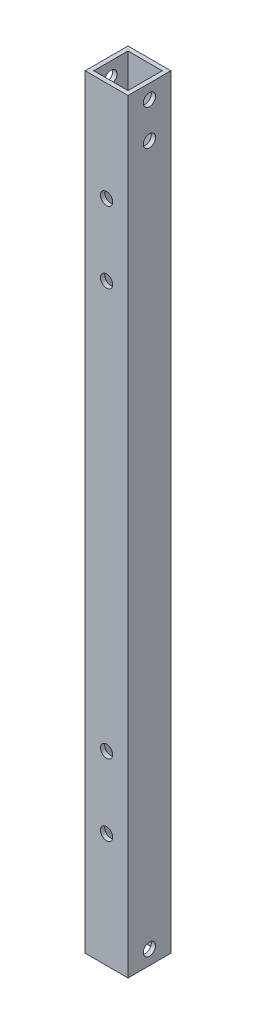
ISO-10303-21;
HEADER;
FILE_DESCRIPTION(('STEP AP214'),'2;1');
FILE_NAME('part.step','',(''),(''),'','','');
FILE_SCHEMA(('AUTOMOTIVE_DESIGN { 1 0 10303 214 1 1 1 1 }'));
ENDSEC;
DATA;
#1=APPLICATION_CONTEXT('core data for automotive mechanical design processes');
#2=APPLICATION_PROTOCOL_DEFINITION('international standard','automotive_design',2000,#1);
#3=PRODUCT_CONTEXT('',#1,'mechanical');
#4=PRODUCT('Part','Part','',(#3));
#5=PRODUCT_RELATED_PRODUCT_CATEGORY('part','',(#4));
#6=PRODUCT_DEFINITION_FORMATION('','',#4);
#7=PRODUCT_DEFINITION_CONTEXT('part definition',#1,'design');
#8=PRODUCT_DEFINITION('design','',#6,#7);
#9=PRODUCT_DEFINITION_SHAPE('','',#8);
#10=(LENGTH_UNIT() NAMED_UNIT(*) SI_UNIT(.MILLI.,.METRE.));
#11=(NAMED_UNIT(*) PLANE_ANGLE_UNIT() SI_UNIT($,.RADIAN.));
#12=(NAMED_UNIT(*) SI_UNIT($,.STERADIAN.) SOLID_ANGLE_UNIT());
#13=UNCERTAINTY_MEASURE_WITH_UNIT(LENGTH_MEASURE(1.E-05),#10,'distance_accuracy_value','');
#14=(GEOMETRIC_REPRESENTATION_CONTEXT(3) GLOBAL_UNCERTAINTY_ASSIGNED_CONTEXT((#13)) GLOBAL_UNIT_ASSIGNED_CONTEXT((#10,
#11,#12)) REPRESENTATION_CONTEXT('',''));
#15=CARTESIAN_POINT('',(0.,0.,0.));
#16=DIRECTION('',(0.,0.,1.));
#17=DIRECTION('',(1.,0.,0.));
#18=AXIS2_PLACEMENT_3D('',#15,#16,#17);
#19=CARTESIAN_POINT('',(0.,267.5,0.));
#20=DIRECTION('',(0.,1.,0.));
#21=DIRECTION('',(0.,0.,1.));
#22=AXIS2_PLACEMENT_3D('',#19,#20,#21);
#23=PLANE('',#22);
#24=DIRECTION('',(0.,0.,-1.));
#25=VECTOR('',#24,1.);
#26=CARTESIAN_POINT('',(7.5,267.5,-7.5));
#27=LINE('',#26,#25);
#28=CARTESIAN_POINT('',(7.5,267.5,7.5));
#29=VERTEX_POINT('',#28);
#30=CARTESIAN_POINT('',(7.5,267.5,-7.5));
#31=VERTEX_POINT('',#30);
#32=EDGE_CURVE('E164',#29,#31,#27,.T.);
#33=ORIENTED_EDGE('',*,*,#32,.T.);
#34=DIRECTION('',(-1.,0.,0.));
#35=VECTOR('',#34,1.);
#36=CARTESIAN_POINT('',(-7.5,267.5,-7.5));
#37=LINE('',#36,#35);
#38=CARTESIAN_POINT('',(-7.5,267.5,-7.5));
#39=VERTEX_POINT('',#38);
#40=EDGE_CURVE('E167',#31,#39,#37,.T.);
#41=ORIENTED_EDGE('',*,*,#40,.T.);
#42=DIRECTION('',(0.,0.,1.));
#43=VECTOR('',#42,1.);
#44=CARTESIAN_POINT('',(-7.5,267.5,-7.5));
#45=LINE('',#44,#43);
#46=CARTESIAN_POINT('',(-7.5,267.5,7.5));
#47=VERTEX_POINT('',#46);
#48=EDGE_CURVE('E170',#39,#47,#45,.T.);
#49=ORIENTED_EDGE('',*,*,#48,.T.);
#50=DIRECTION('',(1.,0.,0.));
#51=VECTOR('',#50,1.);
#52=CARTESIAN_POINT('',(-7.5,267.5,7.5));
#53=LINE('',#52,#51);
#54=EDGE_CURVE('E172',#47,#29,#53,.T.);
#55=ORIENTED_EDGE('',*,*,#54,.T.);
#56=EDGE_LOOP('',(#33,#41,#49,#55));
#57=FACE_BOUND('',#56,.T.);
#58=DIRECTION('',(-1.,0.,0.));
#59=VECTOR('',#58,1.);
#60=CARTESIAN_POINT('',(-7.5,267.5,-6.));
#61=LINE('',#60,#59);
#62=CARTESIAN_POINT('',(6.,267.5,-6.));
#63=VERTEX_POINT('',#62);
#64=CARTESIAN_POINT('',(-6.,267.5,-6.));
#65=VERTEX_POINT('',#64);
#66=EDGE_CURVE('E134',#63,#65,#61,.T.);
#67=ORIENTED_EDGE('',*,*,#66,.F.);
#68=DIRECTION('',(0.,0.,-1.));
#69=VECTOR('',#68,1.);
#70=CARTESIAN_POINT('',(6.,267.5,-7.5));
#71=LINE('',#70,#69);
#72=CARTESIAN_POINT('',(6.,267.5,6.));
#73=VERTEX_POINT('',#72);
#74=EDGE_CURVE('E126',#73,#63,#71,.T.);
#75=ORIENTED_EDGE('',*,*,#74,.F.);
#76=DIRECTION('',(1.,0.,0.));
#77=VECTOR('',#76,1.);
#78=CARTESIAN_POINT('',(-7.5,267.5,6.));
#79=LINE('',#78,#77);
#80=CARTESIAN_POINT('',(-6.,267.5,6.));
#81=VERTEX_POINT('',#80);
#82=EDGE_CURVE('E148',#81,#73,#79,.T.);
#83=ORIENTED_EDGE('',*,*,#82,.F.);
#84=DIRECTION('',(0.,0.,1.));
#85=VECTOR('',#84,1.);
#86=CARTESIAN_POINT('',(-6.,267.5,-7.5));
#87=LINE('',#86,#85);
#88=EDGE_CURVE('E146',#65,#81,#87,.T.);
#89=ORIENTED_EDGE('',*,*,#88,.F.);
#90=EDGE_LOOP('',(#67,#75,#83,#89));
#91=FACE_BOUND('',#90,.T.);
#92=ADVANCED_FACE('F59',(#57,#91),#23,.T.);
#93=CARTESIAN_POINT('',(0.,0.,0.));
#94=DIRECTION('',(0.,1.,0.));
#95=DIRECTION('',(0.,0.,1.));
#96=AXIS2_PLACEMENT_3D('',#93,#94,#95);
#97=PLANE('',#96);
#98=DIRECTION('',(0.,0.,-1.));
#99=VECTOR('',#98,1.);
#100=CARTESIAN_POINT('',(7.5,0.,-7.5));
#101=LINE('',#100,#99);
#102=CARTESIAN_POINT('',(7.5,0.,7.5));
#103=VERTEX_POINT('',#102);
#104=CARTESIAN_POINT('',(7.5,0.,-7.5));
#105=VERTEX_POINT('',#104);
#106=EDGE_CURVE('E142',#103,#105,#101,.T.);
#107=ORIENTED_EDGE('',*,*,#106,.F.);
#108=DIRECTION('',(1.,0.,0.));
#109=VECTOR('',#108,1.);
#110=CARTESIAN_POINT('',(-7.5,0.,7.5));
#111=LINE('',#110,#109);
#112=CARTESIAN_POINT('',(-7.5,0.,7.5));
#113=VERTEX_POINT('',#112);
#114=EDGE_CURVE('E168',#113,#103,#111,.T.);
#115=ORIENTED_EDGE('',*,*,#114,.F.);
#116=DIRECTION('',(0.,0.,1.));
#117=VECTOR('',#116,1.);
#118=CARTESIAN_POINT('',(-7.5,0.,-7.5));
#119=LINE('',#118,#117);
#120=CARTESIAN_POINT('',(-7.5,0.,-7.5));
#121=VERTEX_POINT('',#120);
#122=EDGE_CURVE('E179',#121,#113,#119,.T.);
#123=ORIENTED_EDGE('',*,*,#122,.F.);
#124=DIRECTION('',(-1.,0.,0.));
#125=VECTOR('',#124,1.);
#126=CARTESIAN_POINT('',(-7.5,0.,-7.5));
#127=LINE('',#126,#125);
#128=EDGE_CURVE('E177',#105,#121,#127,.T.);
#129=ORIENTED_EDGE('',*,*,#128,.F.);
#130=EDGE_LOOP('',(#107,#115,#123,#129));
#131=FACE_BOUND('',#130,.T.);
#132=DIRECTION('',(0.,0.,-1.));
#133=VECTOR('',#132,1.);
#134=CARTESIAN_POINT('',(6.,0.,-7.5));
#135=LINE('',#134,#133);
#136=CARTESIAN_POINT('',(6.,0.,6.));
#137=VERTEX_POINT('',#136);
#138=CARTESIAN_POINT('',(6.,0.,-6.));
#139=VERTEX_POINT('',#138);
#140=EDGE_CURVE('E84',#137,#139,#135,.T.);
#141=ORIENTED_EDGE('',*,*,#140,.T.);
#142=DIRECTION('',(-1.,0.,0.));
#143=VECTOR('',#142,1.);
#144=CARTESIAN_POINT('',(-7.5,0.,-6.));
#145=LINE('',#144,#143);
#146=CARTESIAN_POINT('',(-6.,0.,-6.));
#147=VERTEX_POINT('',#146);
#148=EDGE_CURVE('E141',#139,#147,#145,.T.);
#149=ORIENTED_EDGE('',*,*,#148,.T.);
#150=DIRECTION('',(0.,0.,1.));
#151=VECTOR('',#150,1.);
#152=CARTESIAN_POINT('',(-6.,0.,-7.5));
#153=LINE('',#152,#151);
#154=CARTESIAN_POINT('',(-6.,0.,6.));
#155=VERTEX_POINT('',#154);
#156=EDGE_CURVE('E156',#147,#155,#153,.T.);
#157=ORIENTED_EDGE('',*,*,#156,.T.);
#158=DIRECTION('',(1.,0.,0.));
#159=VECTOR('',#158,1.);
#160=CARTESIAN_POINT('',(-7.5,0.,6.));
#161=LINE('',#160,#159);
#162=EDGE_CURVE('E135',#155,#137,#161,.T.);
#163=ORIENTED_EDGE('',*,*,#162,.T.);
#164=EDGE_LOOP('',(#141,#149,#157,#163));
#165=FACE_BOUND('',#164,.T.);
#166=ADVANCED_FACE('F263',(#131,#165),#97,.F.);
#167=CARTESIAN_POINT('',(7.5,267.5,-7.5));
#168=DIRECTION('',(-1.,0.,0.));
#169=DIRECTION('',(0.,0.,1.));
#170=AXIS2_PLACEMENT_3D('',#167,#168,#169);
#171=PLANE('',#170);
#172=CARTESIAN_POINT('',(7.5,5.,0.));
#173=DIRECTION('',(-1.,0.,0.));
#174=DIRECTION('',(0.,0.,1.));
#175=AXIS2_PLACEMENT_3D('',#172,#173,#174);
#176=CIRCLE('',#175,2.15);
#177=CARTESIAN_POINT('',(7.5,5.,2.15000000000004));
#178=VERTEX_POINT('',#177);
#179=EDGE_CURVE('E229',#178,#178,#176,.T.);
#180=ORIENTED_EDGE('',*,*,#179,.T.);
#181=EDGE_LOOP('',(#180));
#182=FACE_BOUND('',#181,.T.);
#183=CARTESIAN_POINT('',(7.5,262.5,0.));
#184=DIRECTION('',(-1.,0.,0.));
#185=DIRECTION('',(0.,0.,1.));
#186=AXIS2_PLACEMENT_3D('',#183,#184,#185);
#187=CIRCLE('',#186,2.15000000000001);
#188=CARTESIAN_POINT('',(7.5,262.5,2.15000000000005));
#189=VERTEX_POINT('',#188);
#190=EDGE_CURVE('E235',#189,#189,#187,.T.);
#191=ORIENTED_EDGE('',*,*,#190,.T.);
#192=EDGE_LOOP('',(#191));
#193=FACE_BOUND('',#192,.T.);
#194=CARTESIAN_POINT('',(7.5,250.,0.));
#195=DIRECTION('',(-1.,0.,0.));
#196=DIRECTION('',(0.,0.,1.));
#197=AXIS2_PLACEMENT_3D('',#194,#195,#196);
#198=CIRCLE('',#197,2.15000000000001);
#199=CARTESIAN_POINT('',(7.5,250.,2.15000000000005));
#200=VERTEX_POINT('',#199);
#201=EDGE_CURVE('E226',#200,#200,#198,.T.);
#202=ORIENTED_EDGE('',*,*,#201,.T.);
#203=EDGE_LOOP('',(#202));
#204=FACE_BOUND('',#203,.T.);
#205=ORIENTED_EDGE('',*,*,#106,.T.);
#206=DIRECTION('',(0.,-1.,0.));
#207=VECTOR('',#206,1.);
#208=CARTESIAN_POINT('',(7.5,267.5,-7.5));
#209=LINE('',#208,#207);
#210=EDGE_CURVE('E12',#31,#105,#209,.T.);
#211=ORIENTED_EDGE('',*,*,#210,.F.);
#212=ORIENTED_EDGE('',*,*,#32,.F.);
#213=DIRECTION('',(0.,-1.,0.));
#214=VECTOR('',#213,1.);
#215=CARTESIAN_POINT('',(7.5,267.5,7.5));
#216=LINE('',#215,#214);
#217=EDGE_CURVE('E174',#29,#103,#216,.T.);
#218=ORIENTED_EDGE('',*,*,#217,.T.);
#219=EDGE_LOOP('',(#205,#211,#212,#218));
#220=FACE_BOUND('',#219,.T.);
#221=ADVANCED_FACE('F61',(#182,#193,#204,#220),#171,.F.);
#222=CARTESIAN_POINT('',(-7.5,267.5,-7.5));
#223=DIRECTION('',(0.,0.,1.));
#224=DIRECTION('',(1.,0.,0.));
#225=AXIS2_PLACEMENT_3D('',#222,#223,#224);
#226=PLANE('',#225);
#227=CARTESIAN_POINT('',(0.,40.,-7.5));
#228=DIRECTION('',(0.,0.,1.));
#229=DIRECTION('',(1.,0.,0.));
#230=AXIS2_PLACEMENT_3D('',#227,#228,#229);
#231=CIRCLE('',#230,2.15);
#232=CARTESIAN_POINT('',(2.15,40.,-7.5));
#233=VERTEX_POINT('',#232);
#234=EDGE_CURVE('E374',#233,#233,#231,.T.);
#235=ORIENTED_EDGE('',*,*,#234,.T.);
#236=EDGE_LOOP('',(#235));
#237=FACE_BOUND('',#236,.T.);
#238=CARTESIAN_POINT('',(0.,65.,-7.5));
#239=DIRECTION('',(0.,0.,1.));
#240=DIRECTION('',(1.,0.,0.));
#241=AXIS2_PLACEMENT_3D('',#238,#239,#240);
#242=CIRCLE('',#241,2.15);
#243=CARTESIAN_POINT('',(2.15,65.,-7.5));
#244=VERTEX_POINT('',#243);
#245=EDGE_CURVE('E366',#244,#244,#242,.T.);
#246=ORIENTED_EDGE('',*,*,#245,.T.);
#247=EDGE_LOOP('',(#246));
#248=FACE_BOUND('',#247,.T.);
#249=CARTESIAN_POINT('',(0.,232.5,-7.5));
#250=DIRECTION('',(0.,0.,1.));
#251=DIRECTION('',(1.,0.,0.));
#252=AXIS2_PLACEMENT_3D('',#249,#250,#251);
#253=CIRCLE('',#252,2.15000000000002);
#254=CARTESIAN_POINT('',(2.15000000000002,232.5,-7.5));
#255=VERTEX_POINT('',#254);
#256=EDGE_CURVE('E359',#255,#255,#253,.T.);
#257=ORIENTED_EDGE('',*,*,#256,.T.);
#258=EDGE_LOOP('',(#257));
#259=FACE_BOUND('',#258,.T.);
#260=CARTESIAN_POINT('',(0.,207.5,-7.5));
#261=DIRECTION('',(0.,0.,1.));
#262=DIRECTION('',(1.,0.,0.));
#263=AXIS2_PLACEMENT_3D('',#260,#261,#262);
#264=CIRCLE('',#263,2.15000000000001);
#265=CARTESIAN_POINT('',(2.15000000000002,207.5,-7.5));
#266=VERTEX_POINT('',#265);
#267=EDGE_CURVE('E205',#266,#266,#264,.T.);
#268=ORIENTED_EDGE('',*,*,#267,.T.);
#269=EDGE_LOOP('',(#268));
#270=FACE_BOUND('',#269,.T.);
#271=ORIENTED_EDGE('',*,*,#128,.T.);
#272=DIRECTION('',(0.,-1.,0.));
#273=VECTOR('',#272,1.);
#274=CARTESIAN_POINT('',(-7.5,267.5,-7.5));
#275=LINE('',#274,#273);
#276=EDGE_CURVE('E68',#39,#121,#275,.T.);
#277=ORIENTED_EDGE('',*,*,#276,.F.);
#278=ORIENTED_EDGE('',*,*,#40,.F.);
#279=ORIENTED_EDGE('',*,*,#210,.T.);
#280=EDGE_LOOP('',(#271,#277,#278,#279));
#281=FACE_BOUND('',#280,.T.);
#282=ADVANCED_FACE('F262',(#237,#248,#259,#270,#281),#226,.F.);
#283=CARTESIAN_POINT('',(-7.5,267.5,-7.5));
#284=DIRECTION('',(1.,0.,0.));
#285=DIRECTION('',(0.,0.,-1.));
#286=AXIS2_PLACEMENT_3D('',#283,#284,#285);
#287=PLANE('',#286);
#288=CARTESIAN_POINT('',(-7.5,5.,0.));
#289=DIRECTION('',(-1.,0.,0.));
#290=DIRECTION('',(0.,0.,1.));
#291=AXIS2_PLACEMENT_3D('',#288,#289,#290);
#292=CIRCLE('',#291,2.15);
#293=CARTESIAN_POINT('',(-7.5,5.,2.15000000000004));
#294=VERTEX_POINT('',#293);
#295=EDGE_CURVE('E193',#294,#294,#292,.T.);
#296=ORIENTED_EDGE('',*,*,#295,.F.);
#297=EDGE_LOOP('',(#296));
#298=FACE_BOUND('',#297,.T.);
#299=CARTESIAN_POINT('',(-7.5,262.5,0.));
#300=DIRECTION('',(-1.,0.,0.));
#301=DIRECTION('',(0.,0.,1.));
#302=AXIS2_PLACEMENT_3D('',#299,#300,#301);
#303=CIRCLE('',#302,2.15000000000001);
#304=CARTESIAN_POINT('',(-7.5,262.5,2.15000000000005));
#305=VERTEX_POINT('',#304);
#306=EDGE_CURVE('E232',#305,#305,#303,.T.);
#307=ORIENTED_EDGE('',*,*,#306,.F.);
#308=EDGE_LOOP('',(#307));
#309=FACE_BOUND('',#308,.T.);
#310=CARTESIAN_POINT('',(-7.5,250.,0.));
#311=DIRECTION('',(-1.,0.,0.));
#312=DIRECTION('',(0.,0.,1.));
#313=AXIS2_PLACEMENT_3D('',#310,#311,#312);
#314=CIRCLE('',#313,2.15000000000001);
#315=CARTESIAN_POINT('',(-7.5,250.,2.15000000000005));
#316=VERTEX_POINT('',#315);
#317=EDGE_CURVE('E238',#316,#316,#314,.T.);
#318=ORIENTED_EDGE('',*,*,#317,.F.);
#319=EDGE_LOOP('',(#318));
#320=FACE_BOUND('',#319,.T.);
#321=ORIENTED_EDGE('',*,*,#122,.T.);
#322=DIRECTION('',(0.,-1.,0.));
#323=VECTOR('',#322,1.);
#324=CARTESIAN_POINT('',(-7.5,267.5,7.5));
#325=LINE('',#324,#323);
#326=EDGE_CURVE('E184',#47,#113,#325,.T.);
#327=ORIENTED_EDGE('',*,*,#326,.F.);
#328=ORIENTED_EDGE('',*,*,#48,.F.);
#329=ORIENTED_EDGE('',*,*,#276,.T.);
#330=EDGE_LOOP('',(#321,#327,#328,#329));
#331=FACE_BOUND('',#330,.T.);
#332=ADVANCED_FACE('F285',(#298,#309,#320,#331),#287,.F.);
#333=CARTESIAN_POINT('',(-7.5,267.5,7.5));
#334=DIRECTION('',(0.,0.,-1.));
#335=DIRECTION('',(-1.,0.,0.));
#336=AXIS2_PLACEMENT_3D('',#333,#334,#335);
#337=PLANE('',#336);
#338=CARTESIAN_POINT('',(0.,40.,7.5));
#339=DIRECTION('',(0.,0.,1.));
#340=DIRECTION('',(1.,0.,0.));
#341=AXIS2_PLACEMENT_3D('',#338,#339,#340);
#342=CIRCLE('',#341,2.15);
#343=CARTESIAN_POINT('',(2.15,40.,7.5));
#344=VERTEX_POINT('',#343);
#345=EDGE_CURVE('E377',#344,#344,#342,.T.);
#346=ORIENTED_EDGE('',*,*,#345,.F.);
#347=EDGE_LOOP('',(#346));
#348=FACE_BOUND('',#347,.T.);
#349=CARTESIAN_POINT('',(0.,65.,7.5));
#350=DIRECTION('',(0.,0.,1.));
#351=DIRECTION('',(1.,0.,0.));
#352=AXIS2_PLACEMENT_3D('',#349,#350,#351);
#353=CIRCLE('',#352,2.15);
#354=CARTESIAN_POINT('',(2.15,65.,7.5));
#355=VERTEX_POINT('',#354);
#356=EDGE_CURVE('E371',#355,#355,#353,.T.);
#357=ORIENTED_EDGE('',*,*,#356,.F.);
#358=EDGE_LOOP('',(#357));
#359=FACE_BOUND('',#358,.T.);
#360=CARTESIAN_POINT('',(0.,232.5,7.5));
#361=DIRECTION('',(0.,0.,1.));
#362=DIRECTION('',(1.,0.,0.));
#363=AXIS2_PLACEMENT_3D('',#360,#361,#362);
#364=CIRCLE('',#363,2.15000000000002);
#365=CARTESIAN_POINT('',(2.15000000000002,232.5,7.5));
#366=VERTEX_POINT('',#365);
#367=EDGE_CURVE('E362',#366,#366,#364,.T.);
#368=ORIENTED_EDGE('',*,*,#367,.F.);
#369=EDGE_LOOP('',(#368));
#370=FACE_BOUND('',#369,.T.);
#371=CARTESIAN_POINT('',(0.,207.5,7.5));
#372=DIRECTION('',(0.,0.,1.));
#373=DIRECTION('',(1.,0.,0.));
#374=AXIS2_PLACEMENT_3D('',#371,#372,#373);
#375=CIRCLE('',#374,2.15000000000001);
#376=CARTESIAN_POINT('',(2.15000000000002,207.5,7.5));
#377=VERTEX_POINT('',#376);
#378=EDGE_CURVE('E361',#377,#377,#375,.T.);
#379=ORIENTED_EDGE('',*,*,#378,.F.);
#380=EDGE_LOOP('',(#379));
#381=FACE_BOUND('',#380,.T.);
#382=ORIENTED_EDGE('',*,*,#114,.T.);
#383=ORIENTED_EDGE('',*,*,#217,.F.);
#384=ORIENTED_EDGE('',*,*,#54,.F.);
#385=ORIENTED_EDGE('',*,*,#326,.T.);
#386=EDGE_LOOP('',(#382,#383,#384,#385));
#387=FACE_BOUND('',#386,.T.);
#388=ADVANCED_FACE('F283',(#348,#359,#370,#381,#387),#337,.F.);
#389=CARTESIAN_POINT('',(6.,267.5,-7.5));
#390=DIRECTION('',(-1.,0.,0.));
#391=DIRECTION('',(0.,0.,1.));
#392=AXIS2_PLACEMENT_3D('',#389,#390,#391);
#393=PLANE('',#392);
#394=CARTESIAN_POINT('',(6.,5.,0.));
#395=DIRECTION('',(-1.,0.,0.));
#396=DIRECTION('',(0.,0.,1.));
#397=AXIS2_PLACEMENT_3D('',#394,#395,#396);
#398=CIRCLE('',#397,2.15);
#399=CARTESIAN_POINT('',(6.,5.,2.15000000000004));
#400=VERTEX_POINT('',#399);
#401=EDGE_CURVE('E154',#400,#400,#398,.F.);
#402=ORIENTED_EDGE('',*,*,#401,.T.);
#403=EDGE_LOOP('',(#402));
#404=FACE_BOUND('',#403,.T.);
#405=CARTESIAN_POINT('',(6.,262.5,0.));
#406=DIRECTION('',(-1.,0.,0.));
#407=DIRECTION('',(0.,0.,1.));
#408=AXIS2_PLACEMENT_3D('',#405,#406,#407);
#409=CIRCLE('',#408,2.15000000000001);
#410=CARTESIAN_POINT('',(6.,262.5,2.15000000000005));
#411=VERTEX_POINT('',#410);
#412=EDGE_CURVE('E197',#411,#411,#409,.F.);
#413=ORIENTED_EDGE('',*,*,#412,.T.);
#414=EDGE_LOOP('',(#413));
#415=FACE_BOUND('',#414,.T.);
#416=CARTESIAN_POINT('',(6.,250.,0.));
#417=DIRECTION('',(-1.,0.,0.));
#418=DIRECTION('',(0.,0.,1.));
#419=AXIS2_PLACEMENT_3D('',#416,#417,#418);
#420=CIRCLE('',#419,2.15000000000001);
#421=CARTESIAN_POINT('',(6.,250.,2.15000000000005));
#422=VERTEX_POINT('',#421);
#423=EDGE_CURVE('E192',#422,#422,#420,.F.);
#424=ORIENTED_EDGE('',*,*,#423,.T.);
#425=EDGE_LOOP('',(#424));
#426=FACE_BOUND('',#425,.T.);
#427=ORIENTED_EDGE('',*,*,#140,.F.);
#428=DIRECTION('',(0.,-1.,0.));
#429=VECTOR('',#428,1.);
#430=CARTESIAN_POINT('',(6.,267.5,6.));
#431=LINE('',#430,#429);
#432=EDGE_CURVE('E130',#73,#137,#431,.T.);
#433=ORIENTED_EDGE('',*,*,#432,.F.);
#434=ORIENTED_EDGE('',*,*,#74,.T.);
#435=DIRECTION('',(0.,-1.,0.));
#436=VECTOR('',#435,1.);
#437=CARTESIAN_POINT('',(6.,267.5,-6.));
#438=LINE('',#437,#436);
#439=EDGE_CURVE('E129',#63,#139,#438,.T.);
#440=ORIENTED_EDGE('',*,*,#439,.T.);
#441=EDGE_LOOP('',(#427,#433,#434,#440));
#442=FACE_BOUND('',#441,.T.);
#443=ADVANCED_FACE('F128',(#404,#415,#426,#442),#393,.T.);
#444=CARTESIAN_POINT('',(-7.5,267.5,-6.));
#445=DIRECTION('',(0.,0.,1.));
#446=DIRECTION('',(1.,0.,0.));
#447=AXIS2_PLACEMENT_3D('',#444,#445,#446);
#448=PLANE('',#447);
#449=CARTESIAN_POINT('',(0.,40.,-6.));
#450=DIRECTION('',(0.,0.,1.));
#451=DIRECTION('',(1.,0.,0.));
#452=AXIS2_PLACEMENT_3D('',#449,#450,#451);
#453=CIRCLE('',#452,2.15);
#454=CARTESIAN_POINT('',(2.15,40.,-6.));
#455=VERTEX_POINT('',#454);
#456=EDGE_CURVE('E223',#455,#455,#453,.T.);
#457=ORIENTED_EDGE('',*,*,#456,.F.);
#458=EDGE_LOOP('',(#457));
#459=FACE_BOUND('',#458,.T.);
#460=CARTESIAN_POINT('',(0.,65.,-6.));
#461=DIRECTION('',(0.,0.,1.));
#462=DIRECTION('',(1.,0.,0.));
#463=AXIS2_PLACEMENT_3D('',#460,#461,#462);
#464=CIRCLE('',#463,2.15);
#465=CARTESIAN_POINT('',(2.15,65.,-6.));
#466=VERTEX_POINT('',#465);
#467=EDGE_CURVE('E211',#466,#466,#464,.T.);
#468=ORIENTED_EDGE('',*,*,#467,.F.);
#469=EDGE_LOOP('',(#468));
#470=FACE_BOUND('',#469,.T.);
#471=CARTESIAN_POINT('',(0.,232.5,-6.));
#472=DIRECTION('',(0.,0.,1.));
#473=DIRECTION('',(1.,0.,0.));
#474=AXIS2_PLACEMENT_3D('',#471,#472,#473);
#475=CIRCLE('',#474,2.15000000000002);
#476=CARTESIAN_POINT('',(2.15000000000002,232.5,-6.));
#477=VERTEX_POINT('',#476);
#478=EDGE_CURVE('E208',#477,#477,#475,.T.);
#479=ORIENTED_EDGE('',*,*,#478,.F.);
#480=EDGE_LOOP('',(#479));
#481=FACE_BOUND('',#480,.T.);
#482=CARTESIAN_POINT('',(0.,207.5,-6.));
#483=DIRECTION('',(0.,0.,1.));
#484=DIRECTION('',(1.,0.,0.));
#485=AXIS2_PLACEMENT_3D('',#482,#483,#484);
#486=CIRCLE('',#485,2.15000000000001);
#487=CARTESIAN_POINT('',(2.15000000000002,207.5,-6.));
#488=VERTEX_POINT('',#487);
#489=EDGE_CURVE('E204',#488,#488,#486,.T.);
#490=ORIENTED_EDGE('',*,*,#489,.F.);
#491=EDGE_LOOP('',(#490));
#492=FACE_BOUND('',#491,.T.);
#493=ORIENTED_EDGE('',*,*,#148,.F.);
#494=ORIENTED_EDGE('',*,*,#439,.F.);
#495=ORIENTED_EDGE('',*,*,#66,.T.);
#496=DIRECTION('',(0.,-1.,0.));
#497=VECTOR('',#496,1.);
#498=CARTESIAN_POINT('',(-6.,267.5,-6.));
#499=LINE('',#498,#497);
#500=EDGE_CURVE('E143',#65,#147,#499,.T.);
#501=ORIENTED_EDGE('',*,*,#500,.T.);
#502=EDGE_LOOP('',(#493,#494,#495,#501));
#503=FACE_BOUND('',#502,.T.);
#504=ADVANCED_FACE('F138',(#459,#470,#481,#492,#503),#448,.T.);
#505=CARTESIAN_POINT('',(-6.,267.5,-7.5));
#506=DIRECTION('',(1.,0.,0.));
#507=DIRECTION('',(0.,0.,-1.));
#508=AXIS2_PLACEMENT_3D('',#505,#506,#507);
#509=PLANE('',#508);
#510=CARTESIAN_POINT('',(-6.,5.,0.));
#511=DIRECTION('',(1.,0.,0.));
#512=DIRECTION('',(0.,0.,-1.));
#513=AXIS2_PLACEMENT_3D('',#510,#511,#512);
#514=CIRCLE('',#513,2.15);
#515=CARTESIAN_POINT('',(-6.,5.,-2.14999999999997));
#516=VERTEX_POINT('',#515);
#517=EDGE_CURVE('E198',#516,#516,#514,.F.);
#518=ORIENTED_EDGE('',*,*,#517,.T.);
#519=EDGE_LOOP('',(#518));
#520=FACE_BOUND('',#519,.T.);
#521=CARTESIAN_POINT('',(-6.,262.5,0.));
#522=DIRECTION('',(1.,0.,0.));
#523=DIRECTION('',(0.,0.,-1.));
#524=AXIS2_PLACEMENT_3D('',#521,#522,#523);
#525=CIRCLE('',#524,2.15000000000001);
#526=CARTESIAN_POINT('',(-6.,262.5,-2.14999999999998));
#527=VERTEX_POINT('',#526);
#528=EDGE_CURVE('E194',#527,#527,#525,.F.);
#529=ORIENTED_EDGE('',*,*,#528,.T.);
#530=EDGE_LOOP('',(#529));
#531=FACE_BOUND('',#530,.T.);
#532=CARTESIAN_POINT('',(-6.,250.,0.));
#533=DIRECTION('',(1.,0.,0.));
#534=DIRECTION('',(0.,0.,-1.));
#535=AXIS2_PLACEMENT_3D('',#532,#533,#534);
#536=CIRCLE('',#535,2.15000000000001);
#537=CARTESIAN_POINT('',(-6.,250.,-2.14999999999997));
#538=VERTEX_POINT('',#537);
#539=EDGE_CURVE('E189',#538,#538,#536,.F.);
#540=ORIENTED_EDGE('',*,*,#539,.T.);
#541=EDGE_LOOP('',(#540));
#542=FACE_BOUND('',#541,.T.);
#543=ORIENTED_EDGE('',*,*,#156,.F.);
#544=ORIENTED_EDGE('',*,*,#500,.F.);
#545=ORIENTED_EDGE('',*,*,#88,.T.);
#546=DIRECTION('',(0.,-1.,0.));
#547=VECTOR('',#546,1.);
#548=CARTESIAN_POINT('',(-6.,267.5,6.));
#549=LINE('',#548,#547);
#550=EDGE_CURVE('E76',#81,#155,#549,.T.);
#551=ORIENTED_EDGE('',*,*,#550,.T.);
#552=EDGE_LOOP('',(#543,#544,#545,#551));
#553=FACE_BOUND('',#552,.T.);
#554=ADVANCED_FACE('F309',(#520,#531,#542,#553),#509,.T.);
#555=CARTESIAN_POINT('',(-7.5,267.5,6.));
#556=DIRECTION('',(0.,0.,-1.));
#557=DIRECTION('',(-1.,0.,0.));
#558=AXIS2_PLACEMENT_3D('',#555,#556,#557);
#559=PLANE('',#558);
#560=CARTESIAN_POINT('',(0.,40.,6.));
#561=DIRECTION('',(0.,0.,-1.));
#562=DIRECTION('',(-1.,0.,0.));
#563=AXIS2_PLACEMENT_3D('',#560,#561,#562);
#564=CIRCLE('',#563,2.15);
#565=CARTESIAN_POINT('',(-2.15,40.,6.));
#566=VERTEX_POINT('',#565);
#567=EDGE_CURVE('E63',#566,#566,#564,.T.);
#568=ORIENTED_EDGE('',*,*,#567,.F.);
#569=EDGE_LOOP('',(#568));
#570=FACE_BOUND('',#569,.T.);
#571=CARTESIAN_POINT('',(0.,65.,6.));
#572=DIRECTION('',(0.,0.,-1.));
#573=DIRECTION('',(-1.,0.,0.));
#574=AXIS2_PLACEMENT_3D('',#571,#572,#573);
#575=CIRCLE('',#574,2.15);
#576=CARTESIAN_POINT('',(-2.15,65.,6.));
#577=VERTEX_POINT('',#576);
#578=EDGE_CURVE('E209',#577,#577,#575,.T.);
#579=ORIENTED_EDGE('',*,*,#578,.F.);
#580=EDGE_LOOP('',(#579));
#581=FACE_BOUND('',#580,.T.);
#582=CARTESIAN_POINT('',(0.,232.5,6.));
#583=DIRECTION('',(0.,0.,-1.));
#584=DIRECTION('',(-1.,0.,0.));
#585=AXIS2_PLACEMENT_3D('',#582,#583,#584);
#586=CIRCLE('',#585,2.15000000000002);
#587=CARTESIAN_POINT('',(-2.15000000000001,232.5,6.));
#588=VERTEX_POINT('',#587);
#589=EDGE_CURVE('E206',#588,#588,#586,.T.);
#590=ORIENTED_EDGE('',*,*,#589,.F.);
#591=EDGE_LOOP('',(#590));
#592=FACE_BOUND('',#591,.T.);
#593=CARTESIAN_POINT('',(0.,207.5,6.));
#594=DIRECTION('',(0.,0.,-1.));
#595=DIRECTION('',(-1.,0.,0.));
#596=AXIS2_PLACEMENT_3D('',#593,#594,#595);
#597=CIRCLE('',#596,2.15000000000001);
#598=CARTESIAN_POINT('',(-2.15,207.5,6.));
#599=VERTEX_POINT('',#598);
#600=EDGE_CURVE('E201',#599,#599,#597,.T.);
#601=ORIENTED_EDGE('',*,*,#600,.F.);
#602=EDGE_LOOP('',(#601));
#603=FACE_BOUND('',#602,.T.);
#604=ORIENTED_EDGE('',*,*,#162,.F.);
#605=ORIENTED_EDGE('',*,*,#550,.F.);
#606=ORIENTED_EDGE('',*,*,#82,.T.);
#607=ORIENTED_EDGE('',*,*,#432,.T.);
#608=EDGE_LOOP('',(#604,#605,#606,#607));
#609=FACE_BOUND('',#608,.T.);
#610=ADVANCED_FACE('F313',(#570,#581,#592,#603,#609),#559,.T.);
#611=CARTESIAN_POINT('',(-7.5,250.,0.));
#612=DIRECTION('',(1.,0.,0.));
#613=DIRECTION('',(0.,0.,-1.));
#614=AXIS2_PLACEMENT_3D('',#611,#612,#613);
#615=CYLINDRICAL_SURFACE('',#614,2.15000000000001);
#616=ORIENTED_EDGE('',*,*,#539,.F.);
#617=EDGE_LOOP('',(#616));
#618=FACE_BOUND('',#617,.T.);
#619=ORIENTED_EDGE('',*,*,#317,.T.);
#620=EDGE_LOOP('',(#619));
#621=FACE_BOUND('',#620,.T.);
#622=ADVANCED_FACE('F317',(#618,#621),#615,.F.);
#623=CARTESIAN_POINT('',(-7.5,262.5,0.));
#624=DIRECTION('',(1.,0.,0.));
#625=DIRECTION('',(0.,0.,-1.));
#626=AXIS2_PLACEMENT_3D('',#623,#624,#625);
#627=CYLINDRICAL_SURFACE('',#626,2.15000000000001);
#628=ORIENTED_EDGE('',*,*,#528,.F.);
#629=EDGE_LOOP('',(#628));
#630=FACE_BOUND('',#629,.T.);
#631=ORIENTED_EDGE('',*,*,#306,.T.);
#632=EDGE_LOOP('',(#631));
#633=FACE_BOUND('',#632,.T.);
#634=ADVANCED_FACE('F321',(#630,#633),#627,.F.);
#635=CARTESIAN_POINT('',(-7.5,5.,0.));
#636=DIRECTION('',(1.,0.,0.));
#637=DIRECTION('',(0.,0.,-1.));
#638=AXIS2_PLACEMENT_3D('',#635,#636,#637);
#639=CYLINDRICAL_SURFACE('',#638,2.15);
#640=ORIENTED_EDGE('',*,*,#517,.F.);
#641=EDGE_LOOP('',(#640));
#642=FACE_BOUND('',#641,.T.);
#643=ORIENTED_EDGE('',*,*,#295,.T.);
#644=EDGE_LOOP('',(#643));
#645=FACE_BOUND('',#644,.T.);
#646=ADVANCED_FACE('F257',(#642,#645),#639,.F.);
#647=ORIENTED_EDGE('',*,*,#423,.F.);
#648=EDGE_LOOP('',(#647));
#649=FACE_BOUND('',#648,.T.);
#650=ORIENTED_EDGE('',*,*,#201,.F.);
#651=EDGE_LOOP('',(#650));
#652=FACE_BOUND('',#651,.T.);
#653=ADVANCED_FACE('F323',(#649,#652),#615,.F.);
#654=ORIENTED_EDGE('',*,*,#412,.F.);
#655=EDGE_LOOP('',(#654));
#656=FACE_BOUND('',#655,.T.);
#657=ORIENTED_EDGE('',*,*,#190,.F.);
#658=EDGE_LOOP('',(#657));
#659=FACE_BOUND('',#658,.T.);
#660=ADVANCED_FACE('F255',(#656,#659),#627,.F.);
#661=ORIENTED_EDGE('',*,*,#401,.F.);
#662=EDGE_LOOP('',(#661));
#663=FACE_BOUND('',#662,.T.);
#664=ORIENTED_EDGE('',*,*,#179,.F.);
#665=EDGE_LOOP('',(#664));
#666=FACE_BOUND('',#665,.T.);
#667=ADVANCED_FACE('F251',(#663,#666),#639,.F.);
#668=CARTESIAN_POINT('',(0.,207.5,-7.5));
#669=DIRECTION('',(0.,0.,1.));
#670=DIRECTION('',(1.,0.,0.));
#671=AXIS2_PLACEMENT_3D('',#668,#669,#670);
#672=CYLINDRICAL_SURFACE('',#671,2.15000000000001);
#673=ORIENTED_EDGE('',*,*,#600,.T.);
#674=EDGE_LOOP('',(#673));
#675=FACE_BOUND('',#674,.T.);
#676=ORIENTED_EDGE('',*,*,#378,.T.);
#677=EDGE_LOOP('',(#676));
#678=FACE_BOUND('',#677,.T.);
#679=ADVANCED_FACE('F254',(#675,#678),#672,.F.);
#680=CARTESIAN_POINT('',(0.,232.5,-7.5));
#681=DIRECTION('',(0.,0.,1.));
#682=DIRECTION('',(1.,0.,0.));
#683=AXIS2_PLACEMENT_3D('',#680,#681,#682);
#684=CYLINDRICAL_SURFACE('',#683,2.15000000000002);
#685=ORIENTED_EDGE('',*,*,#589,.T.);
#686=EDGE_LOOP('',(#685));
#687=FACE_BOUND('',#686,.T.);
#688=ORIENTED_EDGE('',*,*,#367,.T.);
#689=EDGE_LOOP('',(#688));
#690=FACE_BOUND('',#689,.T.);
#691=ADVANCED_FACE('F331',(#687,#690),#684,.F.);
#692=CARTESIAN_POINT('',(0.,65.,-7.5));
#693=DIRECTION('',(0.,0.,1.));
#694=DIRECTION('',(1.,0.,0.));
#695=AXIS2_PLACEMENT_3D('',#692,#693,#694);
#696=CYLINDRICAL_SURFACE('',#695,2.15);
#697=ORIENTED_EDGE('',*,*,#578,.T.);
#698=EDGE_LOOP('',(#697));
#699=FACE_BOUND('',#698,.T.);
#700=ORIENTED_EDGE('',*,*,#356,.T.);
#701=EDGE_LOOP('',(#700));
#702=FACE_BOUND('',#701,.T.);
#703=ADVANCED_FACE('F337',(#699,#702),#696,.F.);
#704=CARTESIAN_POINT('',(0.,40.,-7.5));
#705=DIRECTION('',(0.,0.,1.));
#706=DIRECTION('',(1.,0.,0.));
#707=AXIS2_PLACEMENT_3D('',#704,#705,#706);
#708=CYLINDRICAL_SURFACE('',#707,2.15);
#709=ORIENTED_EDGE('',*,*,#567,.T.);
#710=EDGE_LOOP('',(#709));
#711=FACE_BOUND('',#710,.T.);
#712=ORIENTED_EDGE('',*,*,#345,.T.);
#713=EDGE_LOOP('',(#712));
#714=FACE_BOUND('',#713,.T.);
#715=ADVANCED_FACE('F334',(#711,#714),#708,.F.);
#716=ORIENTED_EDGE('',*,*,#489,.T.);
#717=EDGE_LOOP('',(#716));
#718=FACE_BOUND('',#717,.T.);
#719=ORIENTED_EDGE('',*,*,#267,.F.);
#720=EDGE_LOOP('',(#719));
#721=FACE_BOUND('',#720,.T.);
#722=ADVANCED_FACE('F333',(#718,#721),#672,.F.);
#723=ORIENTED_EDGE('',*,*,#478,.T.);
#724=EDGE_LOOP('',(#723));
#725=FACE_BOUND('',#724,.T.);
#726=ORIENTED_EDGE('',*,*,#256,.F.);
#727=EDGE_LOOP('',(#726));
#728=FACE_BOUND('',#727,.T.);
#729=ADVANCED_FACE('F345',(#725,#728),#684,.F.);
#730=ORIENTED_EDGE('',*,*,#467,.T.);
#731=EDGE_LOOP('',(#730));
#732=FACE_BOUND('',#731,.T.);
#733=ORIENTED_EDGE('',*,*,#245,.F.);
#734=EDGE_LOOP('',(#733));
#735=FACE_BOUND('',#734,.T.);
#736=ADVANCED_FACE('F342',(#732,#735),#696,.F.);
#737=ORIENTED_EDGE('',*,*,#456,.T.);
#738=EDGE_LOOP('',(#737));
#739=FACE_BOUND('',#738,.T.);
#740=ORIENTED_EDGE('',*,*,#234,.F.);
#741=EDGE_LOOP('',(#740));
#742=FACE_BOUND('',#741,.T.);
#743=ADVANCED_FACE('F339',(#739,#742),#708,.F.);
#744=CLOSED_SHELL('',(#92,#166,#221,#282,#332,#388,#443,#504,#554,#610,#622,#634,#646,#653,#660,
#667,#679,#691,#703,#715,#722,#729,#736,#743));
#745=MANIFOLD_SOLID_BREP('B2',#744);
#746=ADVANCED_BREP_SHAPE_REPRESENTATION('',(#18,#745),#14);
#747=SHAPE_DEFINITION_REPRESENTATION(#9,#746);
ENDSEC;
END-ISO-10303-21;
